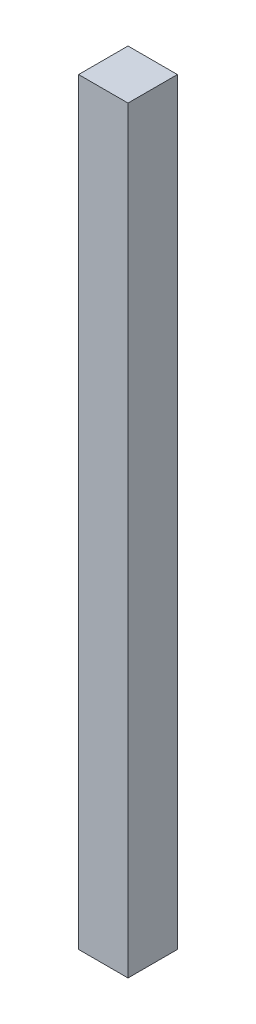
ISO-10303-21;
HEADER;
FILE_DESCRIPTION(('STEP AP214'),'2;1');
FILE_NAME('part.step','',(''),(''),'','','');
FILE_SCHEMA(('AUTOMOTIVE_DESIGN { 1 0 10303 214 1 1 1 1 }'));
ENDSEC;
DATA;
#1=APPLICATION_CONTEXT('core data for automotive mechanical design processes');
#2=APPLICATION_PROTOCOL_DEFINITION('international standard','automotive_design',2000,#1);
#3=PRODUCT_CONTEXT('',#1,'mechanical');
#4=PRODUCT('Part','Part','',(#3));
#5=PRODUCT_RELATED_PRODUCT_CATEGORY('part','',(#4));
#6=PRODUCT_DEFINITION_FORMATION('','',#4);
#7=PRODUCT_DEFINITION_CONTEXT('part definition',#1,'design');
#8=PRODUCT_DEFINITION('design','',#6,#7);
#9=PRODUCT_DEFINITION_SHAPE('','',#8);
#10=(LENGTH_UNIT() NAMED_UNIT(*) SI_UNIT(.MILLI.,.METRE.));
#11=(NAMED_UNIT(*) PLANE_ANGLE_UNIT() SI_UNIT($,.RADIAN.));
#12=(NAMED_UNIT(*) SI_UNIT($,.STERADIAN.) SOLID_ANGLE_UNIT());
#13=UNCERTAINTY_MEASURE_WITH_UNIT(LENGTH_MEASURE(1.E-05),#10,'distance_accuracy_value','');
#14=(GEOMETRIC_REPRESENTATION_CONTEXT(3) GLOBAL_UNCERTAINTY_ASSIGNED_CONTEXT((#13)) GLOBAL_UNIT_ASSIGNED_CONTEXT((#10,
#11,#12)) REPRESENTATION_CONTEXT('',''));
#15=CARTESIAN_POINT('',(0.,0.,0.));
#16=DIRECTION('',(0.,0.,1.));
#17=DIRECTION('',(1.,0.,0.));
#18=AXIS2_PLACEMENT_3D('',#15,#16,#17);
#19=CARTESIAN_POINT('',(7.5,230.,-7.5));
#20=DIRECTION('',(-1.,0.,0.));
#21=DIRECTION('',(0.,0.,1.));
#22=AXIS2_PLACEMENT_3D('',#19,#20,#21);
#23=PLANE('',#22);
#24=DIRECTION('',(0.,0.,-1.));
#25=VECTOR('',#24,1.);
#26=CARTESIAN_POINT('',(7.5,0.,-7.5));
#27=LINE('',#26,#25);
#28=CARTESIAN_POINT('',(7.5,0.,7.5));
#29=VERTEX_POINT('',#28);
#30=CARTESIAN_POINT('',(7.5,0.,-7.5));
#31=VERTEX_POINT('',#30);
#32=EDGE_CURVE('E98',#29,#31,#27,.T.);
#33=ORIENTED_EDGE('',*,*,#32,.T.);
#34=DIRECTION('',(0.,-1.,0.));
#35=VECTOR('',#34,1.);
#36=CARTESIAN_POINT('',(7.5,230.,-7.5));
#37=LINE('',#36,#35);
#38=CARTESIAN_POINT('',(7.5,230.,-7.5));
#39=VERTEX_POINT('',#38);
#40=EDGE_CURVE('E11',#39,#31,#37,.T.);
#41=ORIENTED_EDGE('',*,*,#40,.F.);
#42=DIRECTION('',(0.,0.,-1.));
#43=VECTOR('',#42,1.);
#44=CARTESIAN_POINT('',(7.5,230.,-7.5));
#45=LINE('',#44,#43);
#46=CARTESIAN_POINT('',(7.5,230.,7.5));
#47=VERTEX_POINT('',#46);
#48=EDGE_CURVE('E86',#47,#39,#45,.T.);
#49=ORIENTED_EDGE('',*,*,#48,.F.);
#50=DIRECTION('',(0.,-1.,0.));
#51=VECTOR('',#50,1.);
#52=CARTESIAN_POINT('',(7.5,230.,7.5));
#53=LINE('',#52,#51);
#54=EDGE_CURVE('E94',#47,#29,#53,.T.);
#55=ORIENTED_EDGE('',*,*,#54,.T.);
#56=EDGE_LOOP('',(#33,#41,#49,#55));
#57=FACE_BOUND('',#56,.T.);
#58=ADVANCED_FACE('F35',(#57),#23,.F.);
#59=CARTESIAN_POINT('',(-7.5,230.,-7.5));
#60=DIRECTION('',(0.,0.,1.));
#61=DIRECTION('',(1.,0.,0.));
#62=AXIS2_PLACEMENT_3D('',#59,#60,#61);
#63=PLANE('',#62);
#64=DIRECTION('',(-1.,0.,0.));
#65=VECTOR('',#64,1.);
#66=CARTESIAN_POINT('',(-7.5,0.,-7.5));
#67=LINE('',#66,#65);
#68=CARTESIAN_POINT('',(-7.5,0.,-7.5));
#69=VERTEX_POINT('',#68);
#70=EDGE_CURVE('E90',#31,#69,#67,.T.);
#71=ORIENTED_EDGE('',*,*,#70,.T.);
#72=DIRECTION('',(0.,-1.,0.));
#73=VECTOR('',#72,1.);
#74=CARTESIAN_POINT('',(-7.5,230.,-7.5));
#75=LINE('',#74,#73);
#76=CARTESIAN_POINT('',(-7.5,230.,-7.5));
#77=VERTEX_POINT('',#76);
#78=EDGE_CURVE('E43',#77,#69,#75,.T.);
#79=ORIENTED_EDGE('',*,*,#78,.F.);
#80=DIRECTION('',(-1.,0.,0.));
#81=VECTOR('',#80,1.);
#82=CARTESIAN_POINT('',(-7.5,230.,-7.5));
#83=LINE('',#82,#81);
#84=EDGE_CURVE('E81',#39,#77,#83,.T.);
#85=ORIENTED_EDGE('',*,*,#84,.F.);
#86=ORIENTED_EDGE('',*,*,#40,.T.);
#87=EDGE_LOOP('',(#71,#79,#85,#86));
#88=FACE_BOUND('',#87,.T.);
#89=ADVANCED_FACE('F89',(#88),#63,.F.);
#90=CARTESIAN_POINT('',(-7.5,230.,-7.5));
#91=DIRECTION('',(1.,0.,0.));
#92=DIRECTION('',(0.,0.,-1.));
#93=AXIS2_PLACEMENT_3D('',#90,#91,#92);
#94=PLANE('',#93);
#95=DIRECTION('',(0.,0.,1.));
#96=VECTOR('',#95,1.);
#97=CARTESIAN_POINT('',(-7.5,0.,-7.5));
#98=LINE('',#97,#96);
#99=CARTESIAN_POINT('',(-7.5,0.,7.5));
#100=VERTEX_POINT('',#99);
#101=EDGE_CURVE('E68',#69,#100,#98,.T.);
#102=ORIENTED_EDGE('',*,*,#101,.T.);
#103=DIRECTION('',(0.,-1.,0.));
#104=VECTOR('',#103,1.);
#105=CARTESIAN_POINT('',(-7.5,230.,7.5));
#106=LINE('',#105,#104);
#107=CARTESIAN_POINT('',(-7.5,230.,7.5));
#108=VERTEX_POINT('',#107);
#109=EDGE_CURVE('E91',#108,#100,#106,.T.);
#110=ORIENTED_EDGE('',*,*,#109,.F.);
#111=DIRECTION('',(0.,0.,1.));
#112=VECTOR('',#111,1.);
#113=CARTESIAN_POINT('',(-7.5,230.,-7.5));
#114=LINE('',#113,#112);
#115=EDGE_CURVE('E84',#77,#108,#114,.T.);
#116=ORIENTED_EDGE('',*,*,#115,.F.);
#117=ORIENTED_EDGE('',*,*,#78,.T.);
#118=EDGE_LOOP('',(#102,#110,#116,#117));
#119=FACE_BOUND('',#118,.T.);
#120=ADVANCED_FACE('F92',(#119),#94,.F.);
#121=CARTESIAN_POINT('',(-7.5,230.,7.5));
#122=DIRECTION('',(0.,0.,-1.));
#123=DIRECTION('',(-1.,0.,0.));
#124=AXIS2_PLACEMENT_3D('',#121,#122,#123);
#125=PLANE('',#124);
#126=DIRECTION('',(1.,0.,0.));
#127=VECTOR('',#126,1.);
#128=CARTESIAN_POINT('',(-7.5,0.,7.5));
#129=LINE('',#128,#127);
#130=EDGE_CURVE('E74',#100,#29,#129,.T.);
#131=ORIENTED_EDGE('',*,*,#130,.T.);
#132=ORIENTED_EDGE('',*,*,#54,.F.);
#133=DIRECTION('',(1.,0.,0.));
#134=VECTOR('',#133,1.);
#135=CARTESIAN_POINT('',(-7.5,230.,7.5));
#136=LINE('',#135,#134);
#137=EDGE_CURVE('E51',#108,#47,#136,.T.);
#138=ORIENTED_EDGE('',*,*,#137,.F.);
#139=ORIENTED_EDGE('',*,*,#109,.T.);
#140=EDGE_LOOP('',(#131,#132,#138,#139));
#141=FACE_BOUND('',#140,.T.);
#142=ADVANCED_FACE('F105',(#141),#125,.F.);
#143=CARTESIAN_POINT('',(0.,230.,0.));
#144=DIRECTION('',(0.,1.,0.));
#145=DIRECTION('',(0.,0.,1.));
#146=AXIS2_PLACEMENT_3D('',#143,#144,#145);
#147=PLANE('',#146);
#148=ORIENTED_EDGE('',*,*,#48,.T.);
#149=ORIENTED_EDGE('',*,*,#84,.T.);
#150=ORIENTED_EDGE('',*,*,#115,.T.);
#151=ORIENTED_EDGE('',*,*,#137,.T.);
#152=EDGE_LOOP('',(#148,#149,#150,#151));
#153=FACE_BOUND('',#152,.T.);
#154=ADVANCED_FACE('F82',(#153),#147,.T.);
#155=CARTESIAN_POINT('',(0.,0.,0.));
#156=DIRECTION('',(0.,1.,0.));
#157=DIRECTION('',(0.,0.,1.));
#158=AXIS2_PLACEMENT_3D('',#155,#156,#157);
#159=PLANE('',#158);
#160=ORIENTED_EDGE('',*,*,#32,.F.);
#161=ORIENTED_EDGE('',*,*,#130,.F.);
#162=ORIENTED_EDGE('',*,*,#101,.F.);
#163=ORIENTED_EDGE('',*,*,#70,.F.);
#164=EDGE_LOOP('',(#160,#161,#162,#163));
#165=FACE_BOUND('',#164,.T.);
#166=ADVANCED_FACE('F108',(#165),#159,.F.);
#167=CLOSED_SHELL('',(#58,#89,#120,#142,#154,#166));
#168=MANIFOLD_SOLID_BREP('B2',#167);
#169=ADVANCED_BREP_SHAPE_REPRESENTATION('',(#18,#168),#14);
#170=SHAPE_DEFINITION_REPRESENTATION(#9,#169);
ENDSEC;
END-ISO-10303-21;
